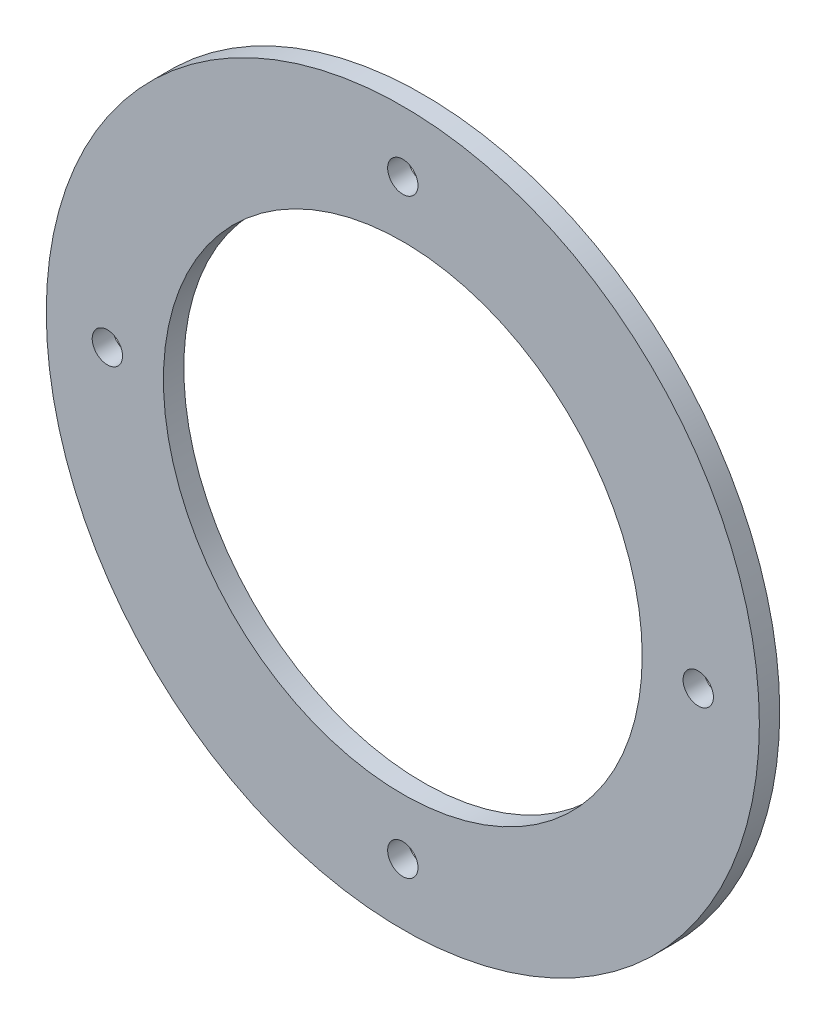
ISO-10303-21;
HEADER;
FILE_DESCRIPTION(('STEP AP214'),'2;1');
FILE_NAME('part.step','',(''),(''),'','','');
FILE_SCHEMA(('AUTOMOTIVE_DESIGN { 1 0 10303 214 1 1 1 1 }'));
ENDSEC;
DATA;
#1=APPLICATION_CONTEXT('core data for automotive mechanical design processes');
#2=APPLICATION_PROTOCOL_DEFINITION('international standard','automotive_design',2000,#1);
#3=PRODUCT_CONTEXT('',#1,'mechanical');
#4=PRODUCT('Part','Part','',(#3));
#5=PRODUCT_RELATED_PRODUCT_CATEGORY('part','',(#4));
#6=PRODUCT_DEFINITION_FORMATION('','',#4);
#7=PRODUCT_DEFINITION_CONTEXT('part definition',#1,'design');
#8=PRODUCT_DEFINITION('design','',#6,#7);
#9=PRODUCT_DEFINITION_SHAPE('','',#8);
#10=(LENGTH_UNIT() NAMED_UNIT(*) SI_UNIT(.MILLI.,.METRE.));
#11=(NAMED_UNIT(*) PLANE_ANGLE_UNIT() SI_UNIT($,.RADIAN.));
#12=(NAMED_UNIT(*) SI_UNIT($,.STERADIAN.) SOLID_ANGLE_UNIT());
#13=UNCERTAINTY_MEASURE_WITH_UNIT(LENGTH_MEASURE(1.E-05),#10,'distance_accuracy_value','');
#14=(GEOMETRIC_REPRESENTATION_CONTEXT(3) GLOBAL_UNCERTAINTY_ASSIGNED_CONTEXT((#13)) GLOBAL_UNIT_ASSIGNED_CONTEXT((#10,
#11,#12)) REPRESENTATION_CONTEXT('',''));
#15=CARTESIAN_POINT('',(0.,0.,0.));
#16=DIRECTION('',(0.,0.,1.));
#17=DIRECTION('',(1.,0.,0.));
#18=AXIS2_PLACEMENT_3D('',#15,#16,#17);
#19=CARTESIAN_POINT('',(0.,0.,2.));
#20=DIRECTION('',(0.,0.,1.));
#21=DIRECTION('',(1.,0.,0.));
#22=AXIS2_PLACEMENT_3D('',#19,#20,#21);
#23=PLANE('',#22);
#24=CARTESIAN_POINT('',(-29.,0.,2.));
#25=DIRECTION('',(0.,0.,1.));
#26=DIRECTION('',(1.,0.,0.));
#27=AXIS2_PLACEMENT_3D('',#24,#25,#26);
#28=CIRCLE('',#27,1.49);
#29=CARTESIAN_POINT('',(-27.51,0.,2.));
#30=VERTEX_POINT('',#29);
#31=EDGE_CURVE('E59',#30,#30,#28,.T.);
#32=ORIENTED_EDGE('',*,*,#31,.F.);
#33=EDGE_LOOP('',(#32));
#34=FACE_BOUND('',#33,.T.);
#35=CARTESIAN_POINT('',(29.,0.,2.));
#36=DIRECTION('',(0.,0.,1.));
#37=DIRECTION('',(1.,0.,0.));
#38=AXIS2_PLACEMENT_3D('',#35,#36,#37);
#39=CIRCLE('',#38,1.49);
#40=CARTESIAN_POINT('',(30.49,0.,2.));
#41=VERTEX_POINT('',#40);
#42=EDGE_CURVE('E47',#41,#41,#39,.T.);
#43=ORIENTED_EDGE('',*,*,#42,.F.);
#44=EDGE_LOOP('',(#43));
#45=FACE_BOUND('',#44,.T.);
#46=CARTESIAN_POINT('',(0.,0.,2.));
#47=DIRECTION('',(0.,0.,1.));
#48=DIRECTION('',(1.,0.,0.));
#49=AXIS2_PLACEMENT_3D('',#46,#47,#48);
#50=CIRCLE('',#49,35.);
#51=CARTESIAN_POINT('',(35.,0.,2.));
#52=VERTEX_POINT('',#51);
#53=EDGE_CURVE('E10',#52,#52,#50,.T.);
#54=ORIENTED_EDGE('',*,*,#53,.T.);
#55=EDGE_LOOP('',(#54));
#56=FACE_BOUND('',#55,.T.);
#57=CARTESIAN_POINT('',(0.,0.,2.));
#58=DIRECTION('',(0.,0.,1.));
#59=DIRECTION('',(1.,0.,0.));
#60=AXIS2_PLACEMENT_3D('',#57,#58,#59);
#61=CIRCLE('',#60,23.5);
#62=CARTESIAN_POINT('',(23.5,0.,2.));
#63=VERTEX_POINT('',#62);
#64=EDGE_CURVE('E42',#63,#63,#61,.T.);
#65=ORIENTED_EDGE('',*,*,#64,.F.);
#66=EDGE_LOOP('',(#65));
#67=FACE_BOUND('',#66,.T.);
#68=CARTESIAN_POINT('',(0.,29.,2.));
#69=DIRECTION('',(0.,0.,1.));
#70=DIRECTION('',(1.,0.,0.));
#71=AXIS2_PLACEMENT_3D('',#68,#69,#70);
#72=CIRCLE('',#71,1.49);
#73=CARTESIAN_POINT('',(1.49,29.,2.));
#74=VERTEX_POINT('',#73);
#75=EDGE_CURVE('E53',#74,#74,#72,.T.);
#76=ORIENTED_EDGE('',*,*,#75,.F.);
#77=EDGE_LOOP('',(#76));
#78=FACE_BOUND('',#77,.T.);
#79=CARTESIAN_POINT('',(0.,-29.,2.));
#80=DIRECTION('',(0.,0.,1.));
#81=DIRECTION('',(1.,0.,0.));
#82=AXIS2_PLACEMENT_3D('',#79,#80,#81);
#83=CIRCLE('',#82,1.49);
#84=CARTESIAN_POINT('',(1.49,-29.,2.));
#85=VERTEX_POINT('',#84);
#86=EDGE_CURVE('E65',#85,#85,#83,.T.);
#87=ORIENTED_EDGE('',*,*,#86,.F.);
#88=EDGE_LOOP('',(#87));
#89=FACE_BOUND('',#88,.T.);
#90=ADVANCED_FACE('F31',(#34,#45,#56,#67,#78,#89),#23,.T.);
#91=CARTESIAN_POINT('',(0.,0.,0.));
#92=DIRECTION('',(0.,0.,1.));
#93=DIRECTION('',(1.,0.,0.));
#94=AXIS2_PLACEMENT_3D('',#91,#92,#93);
#95=PLANE('',#94);
#96=CARTESIAN_POINT('',(0.,0.,0.));
#97=DIRECTION('',(0.,0.,1.));
#98=DIRECTION('',(1.,0.,0.));
#99=AXIS2_PLACEMENT_3D('',#96,#97,#98);
#100=CIRCLE('',#99,35.);
#101=CARTESIAN_POINT('',(35.,0.,0.));
#102=VERTEX_POINT('',#101);
#103=EDGE_CURVE('E35',#102,#102,#100,.T.);
#104=ORIENTED_EDGE('',*,*,#103,.F.);
#105=EDGE_LOOP('',(#104));
#106=FACE_BOUND('',#105,.T.);
#107=CARTESIAN_POINT('',(0.,0.,0.));
#108=DIRECTION('',(0.,0.,1.));
#109=DIRECTION('',(1.,0.,0.));
#110=AXIS2_PLACEMENT_3D('',#107,#108,#109);
#111=CIRCLE('',#110,23.5);
#112=CARTESIAN_POINT('',(23.5,0.,0.));
#113=VERTEX_POINT('',#112);
#114=EDGE_CURVE('E44',#113,#113,#111,.T.);
#115=ORIENTED_EDGE('',*,*,#114,.T.);
#116=EDGE_LOOP('',(#115));
#117=FACE_BOUND('',#116,.T.);
#118=CARTESIAN_POINT('',(29.,0.,0.));
#119=DIRECTION('',(0.,0.,1.));
#120=DIRECTION('',(1.,0.,0.));
#121=AXIS2_PLACEMENT_3D('',#118,#119,#120);
#122=CIRCLE('',#121,1.49);
#123=CARTESIAN_POINT('',(30.49,0.,0.));
#124=VERTEX_POINT('',#123);
#125=EDGE_CURVE('E50',#124,#124,#122,.T.);
#126=ORIENTED_EDGE('',*,*,#125,.T.);
#127=EDGE_LOOP('',(#126));
#128=FACE_BOUND('',#127,.T.);
#129=CARTESIAN_POINT('',(0.,29.,0.));
#130=DIRECTION('',(0.,0.,1.));
#131=DIRECTION('',(1.,0.,0.));
#132=AXIS2_PLACEMENT_3D('',#129,#130,#131);
#133=CIRCLE('',#132,1.49);
#134=CARTESIAN_POINT('',(1.49,29.,0.));
#135=VERTEX_POINT('',#134);
#136=EDGE_CURVE('E56',#135,#135,#133,.T.);
#137=ORIENTED_EDGE('',*,*,#136,.T.);
#138=EDGE_LOOP('',(#137));
#139=FACE_BOUND('',#138,.T.);
#140=CARTESIAN_POINT('',(-29.,0.,0.));
#141=DIRECTION('',(0.,0.,1.));
#142=DIRECTION('',(1.,0.,0.));
#143=AXIS2_PLACEMENT_3D('',#140,#141,#142);
#144=CIRCLE('',#143,1.49);
#145=CARTESIAN_POINT('',(-27.51,0.,0.));
#146=VERTEX_POINT('',#145);
#147=EDGE_CURVE('E62',#146,#146,#144,.T.);
#148=ORIENTED_EDGE('',*,*,#147,.T.);
#149=EDGE_LOOP('',(#148));
#150=FACE_BOUND('',#149,.T.);
#151=CARTESIAN_POINT('',(0.,-29.,0.));
#152=DIRECTION('',(0.,0.,1.));
#153=DIRECTION('',(1.,0.,0.));
#154=AXIS2_PLACEMENT_3D('',#151,#152,#153);
#155=CIRCLE('',#154,1.49);
#156=CARTESIAN_POINT('',(1.49,-29.,0.));
#157=VERTEX_POINT('',#156);
#158=EDGE_CURVE('E68',#157,#157,#155,.T.);
#159=ORIENTED_EDGE('',*,*,#158,.T.);
#160=EDGE_LOOP('',(#159));
#161=FACE_BOUND('',#160,.T.);
#162=ADVANCED_FACE('F78',(#106,#117,#128,#139,#150,#161),#95,.F.);
#163=CARTESIAN_POINT('',(0.,0.,2.));
#164=DIRECTION('',(0.,0.,-1.));
#165=DIRECTION('',(-1.,0.,0.));
#166=AXIS2_PLACEMENT_3D('',#163,#164,#165);
#167=CYLINDRICAL_SURFACE('',#166,35.);
#168=ORIENTED_EDGE('',*,*,#53,.F.);
#169=EDGE_LOOP('',(#168));
#170=FACE_BOUND('',#169,.T.);
#171=ORIENTED_EDGE('',*,*,#103,.T.);
#172=EDGE_LOOP('',(#171));
#173=FACE_BOUND('',#172,.T.);
#174=ADVANCED_FACE('F33',(#170,#173),#167,.T.);
#175=CARTESIAN_POINT('',(0.,0.,2.));
#176=DIRECTION('',(0.,0.,-1.));
#177=DIRECTION('',(-1.,0.,0.));
#178=AXIS2_PLACEMENT_3D('',#175,#176,#177);
#179=CYLINDRICAL_SURFACE('',#178,23.5);
#180=ORIENTED_EDGE('',*,*,#64,.T.);
#181=EDGE_LOOP('',(#180));
#182=FACE_BOUND('',#181,.T.);
#183=ORIENTED_EDGE('',*,*,#114,.F.);
#184=EDGE_LOOP('',(#183));
#185=FACE_BOUND('',#184,.T.);
#186=ADVANCED_FACE('F88',(#182,#185),#179,.F.);
#187=CARTESIAN_POINT('',(29.,0.,2.));
#188=DIRECTION('',(0.,0.,-1.));
#189=DIRECTION('',(-1.,0.,0.));
#190=AXIS2_PLACEMENT_3D('',#187,#188,#189);
#191=CYLINDRICAL_SURFACE('',#190,1.49);
#192=ORIENTED_EDGE('',*,*,#42,.T.);
#193=EDGE_LOOP('',(#192));
#194=FACE_BOUND('',#193,.T.);
#195=ORIENTED_EDGE('',*,*,#125,.F.);
#196=EDGE_LOOP('',(#195));
#197=FACE_BOUND('',#196,.T.);
#198=ADVANCED_FACE('F91',(#194,#197),#191,.F.);
#199=CARTESIAN_POINT('',(0.,29.,2.));
#200=DIRECTION('',(0.,0.,-1.));
#201=DIRECTION('',(-1.,0.,0.));
#202=AXIS2_PLACEMENT_3D('',#199,#200,#201);
#203=CYLINDRICAL_SURFACE('',#202,1.49);
#204=ORIENTED_EDGE('',*,*,#75,.T.);
#205=EDGE_LOOP('',(#204));
#206=FACE_BOUND('',#205,.T.);
#207=ORIENTED_EDGE('',*,*,#136,.F.);
#208=EDGE_LOOP('',(#207));
#209=FACE_BOUND('',#208,.T.);
#210=ADVANCED_FACE('F95',(#206,#209),#203,.F.);
#211=CARTESIAN_POINT('',(-29.,0.,2.));
#212=DIRECTION('',(0.,0.,-1.));
#213=DIRECTION('',(-1.,0.,0.));
#214=AXIS2_PLACEMENT_3D('',#211,#212,#213);
#215=CYLINDRICAL_SURFACE('',#214,1.49);
#216=ORIENTED_EDGE('',*,*,#31,.T.);
#217=EDGE_LOOP('',(#216));
#218=FACE_BOUND('',#217,.T.);
#219=ORIENTED_EDGE('',*,*,#147,.F.);
#220=EDGE_LOOP('',(#219));
#221=FACE_BOUND('',#220,.T.);
#222=ADVANCED_FACE('F99',(#218,#221),#215,.F.);
#223=CARTESIAN_POINT('',(0.,-29.,2.));
#224=DIRECTION('',(0.,0.,-1.));
#225=DIRECTION('',(-1.,0.,0.));
#226=AXIS2_PLACEMENT_3D('',#223,#224,#225);
#227=CYLINDRICAL_SURFACE('',#226,1.49);
#228=ORIENTED_EDGE('',*,*,#86,.T.);
#229=EDGE_LOOP('',(#228));
#230=FACE_BOUND('',#229,.T.);
#231=ORIENTED_EDGE('',*,*,#158,.F.);
#232=EDGE_LOOP('',(#231));
#233=FACE_BOUND('',#232,.T.);
#234=ADVANCED_FACE('F74',(#230,#233),#227,.F.);
#235=CLOSED_SHELL('',(#90,#162,#174,#186,#198,#210,#222,#234));
#236=MANIFOLD_SOLID_BREP('B2',#235);
#237=ADVANCED_BREP_SHAPE_REPRESENTATION('',(#18,#236),#14);
#238=SHAPE_DEFINITION_REPRESENTATION(#9,#237);
ENDSEC;
END-ISO-10303-21;
